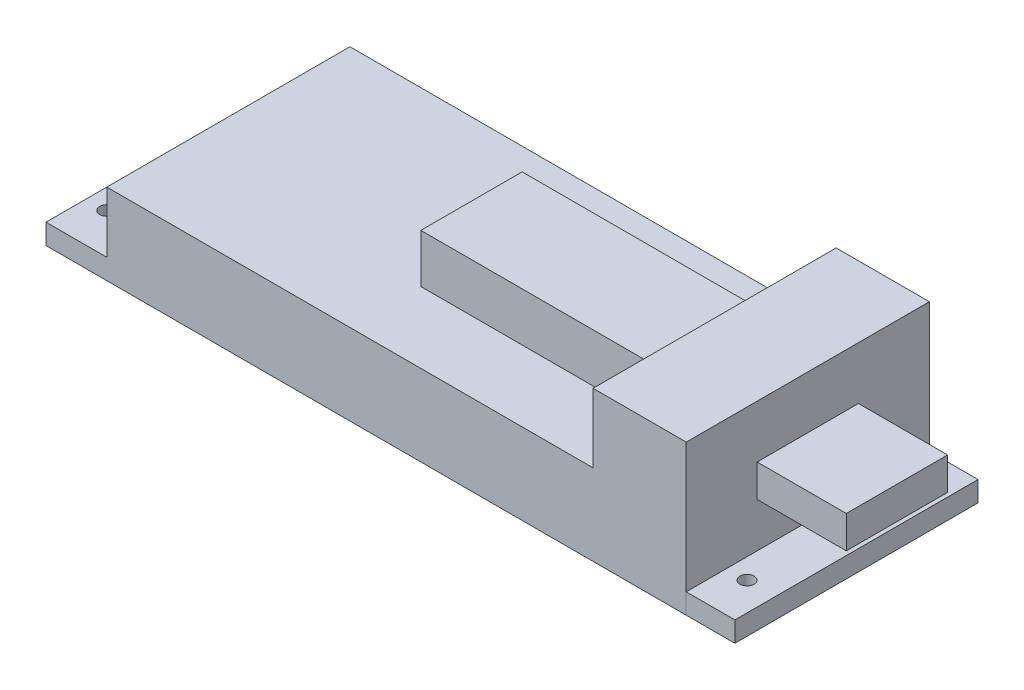
ISO-10303-21;
HEADER;
FILE_DESCRIPTION(('STEP AP214'),'2;1');
FILE_NAME('part.step','',(''),(''),'','','');
FILE_SCHEMA(('AUTOMOTIVE_DESIGN { 1 0 10303 214 1 1 1 1 }'));
ENDSEC;
DATA;
#1=APPLICATION_CONTEXT('core data for automotive mechanical design processes');
#2=APPLICATION_PROTOCOL_DEFINITION('international standard','automotive_design',2000,#1);
#3=PRODUCT_CONTEXT('',#1,'mechanical');
#4=PRODUCT('Part','Part','',(#3));
#5=PRODUCT_RELATED_PRODUCT_CATEGORY('part','',(#4));
#6=PRODUCT_DEFINITION_FORMATION('','',#4);
#7=PRODUCT_DEFINITION_CONTEXT('part definition',#1,'design');
#8=PRODUCT_DEFINITION('design','',#6,#7);
#9=PRODUCT_DEFINITION_SHAPE('','',#8);
#10=(LENGTH_UNIT() NAMED_UNIT(*) SI_UNIT(.MILLI.,.METRE.));
#11=(NAMED_UNIT(*) PLANE_ANGLE_UNIT() SI_UNIT($,.RADIAN.));
#12=(NAMED_UNIT(*) SI_UNIT($,.STERADIAN.) SOLID_ANGLE_UNIT());
#13=UNCERTAINTY_MEASURE_WITH_UNIT(LENGTH_MEASURE(1.E-05),#10,'distance_accuracy_value','');
#14=(GEOMETRIC_REPRESENTATION_CONTEXT(3) GLOBAL_UNCERTAINTY_ASSIGNED_CONTEXT((#13)) GLOBAL_UNIT_ASSIGNED_CONTEXT((#10,
#11,#12)) REPRESENTATION_CONTEXT('',''));
#15=CARTESIAN_POINT('',(0.,0.,0.));
#16=DIRECTION('',(0.,0.,1.));
#17=DIRECTION('',(1.,0.,0.));
#18=AXIS2_PLACEMENT_3D('',#15,#16,#17);
#19=CARTESIAN_POINT('',(73.,5.,0.));
#20=DIRECTION('',(-1.,0.,0.));
#21=DIRECTION('',(0.,0.,1.));
#22=AXIS2_PLACEMENT_3D('',#19,#20,#21);
#23=PLANE('',#22);
#24=DIRECTION('',(0.,0.,-1.));
#25=VECTOR('',#24,1.);
#26=CARTESIAN_POINT('',(73.,0.,0.));
#27=LINE('',#26,#25);
#28=CARTESIAN_POINT('',(73.,0.,30.));
#29=VERTEX_POINT('',#28);
#30=CARTESIAN_POINT('',(73.,0.,-30.));
#31=VERTEX_POINT('',#30);
#32=EDGE_CURVE('E131',#29,#31,#27,.T.);
#33=ORIENTED_EDGE('',*,*,#32,.F.);
#34=DIRECTION('',(0.,-1.,0.));
#35=VECTOR('',#34,1.);
#36=CARTESIAN_POINT('',(73.,5.,30.));
#37=LINE('',#36,#35);
#38=CARTESIAN_POINT('',(73.,5.,30.));
#39=VERTEX_POINT('',#38);
#40=EDGE_CURVE('E12',#39,#29,#37,.T.);
#41=ORIENTED_EDGE('',*,*,#40,.F.);
#42=DIRECTION('',(0.,0.,-1.));
#43=VECTOR('',#42,1.);
#44=CARTESIAN_POINT('',(73.,5.,0.));
#45=LINE('',#44,#43);
#46=CARTESIAN_POINT('',(73.,5.,-30.));
#47=VERTEX_POINT('',#46);
#48=EDGE_CURVE('E111',#39,#47,#45,.T.);
#49=ORIENTED_EDGE('',*,*,#48,.T.);
#50=DIRECTION('',(0.,-1.,0.));
#51=VECTOR('',#50,1.);
#52=CARTESIAN_POINT('',(73.,5.,-30.));
#53=LINE('',#52,#51);
#54=EDGE_CURVE('E72',#47,#31,#53,.T.);
#55=ORIENTED_EDGE('',*,*,#54,.T.);
#56=EDGE_LOOP('',(#33,#41,#49,#55));
#57=FACE_BOUND('',#56,.T.);
#58=ADVANCED_FACE('F55',(#57),#23,.T.);
#59=CARTESIAN_POINT('',(0.,5.,30.));
#60=DIRECTION('',(0.,0.,-1.));
#61=DIRECTION('',(-1.,0.,0.));
#62=AXIS2_PLACEMENT_3D('',#59,#60,#61);
#63=PLANE('',#62);
#64=DIRECTION('',(1.,0.,0.));
#65=VECTOR('',#64,1.);
#66=CARTESIAN_POINT('',(0.,0.,30.));
#67=LINE('',#66,#65);
#68=CARTESIAN_POINT('',(85.,0.,30.));
#69=VERTEX_POINT('',#68);
#70=EDGE_CURVE('E116',#29,#69,#67,.T.);
#71=ORIENTED_EDGE('',*,*,#70,.T.);
#72=DIRECTION('',(0.,-1.,0.));
#73=VECTOR('',#72,1.);
#74=CARTESIAN_POINT('',(85.,5.,30.));
#75=LINE('',#74,#73);
#76=CARTESIAN_POINT('',(85.,5.,30.));
#77=VERTEX_POINT('',#76);
#78=EDGE_CURVE('E64',#77,#69,#75,.T.);
#79=ORIENTED_EDGE('',*,*,#78,.F.);
#80=DIRECTION('',(1.,0.,0.));
#81=VECTOR('',#80,1.);
#82=CARTESIAN_POINT('',(0.,5.,30.));
#83=LINE('',#82,#81);
#84=EDGE_CURVE('E106',#39,#77,#83,.T.);
#85=ORIENTED_EDGE('',*,*,#84,.F.);
#86=ORIENTED_EDGE('',*,*,#40,.T.);
#87=EDGE_LOOP('',(#71,#79,#85,#86));
#88=FACE_BOUND('',#87,.T.);
#89=ADVANCED_FACE('F114',(#88),#63,.F.);
#90=CARTESIAN_POINT('',(85.,5.,0.));
#91=DIRECTION('',(-1.,0.,0.));
#92=DIRECTION('',(0.,0.,1.));
#93=AXIS2_PLACEMENT_3D('',#90,#91,#92);
#94=PLANE('',#93);
#95=DIRECTION('',(0.,0.,-1.));
#96=VECTOR('',#95,1.);
#97=CARTESIAN_POINT('',(85.,0.,0.));
#98=LINE('',#97,#96);
#99=CARTESIAN_POINT('',(85.,0.,-30.));
#100=VERTEX_POINT('',#99);
#101=EDGE_CURVE('E128',#69,#100,#98,.T.);
#102=ORIENTED_EDGE('',*,*,#101,.T.);
#103=DIRECTION('',(0.,-1.,0.));
#104=VECTOR('',#103,1.);
#105=CARTESIAN_POINT('',(85.,5.,-30.));
#106=LINE('',#105,#104);
#107=CARTESIAN_POINT('',(85.,5.,-30.));
#108=VERTEX_POINT('',#107);
#109=EDGE_CURVE('E86',#108,#100,#106,.T.);
#110=ORIENTED_EDGE('',*,*,#109,.F.);
#111=DIRECTION('',(0.,0.,-1.));
#112=VECTOR('',#111,1.);
#113=CARTESIAN_POINT('',(85.,5.,0.));
#114=LINE('',#113,#112);
#115=EDGE_CURVE('E98',#77,#108,#114,.T.);
#116=ORIENTED_EDGE('',*,*,#115,.F.);
#117=ORIENTED_EDGE('',*,*,#78,.T.);
#118=EDGE_LOOP('',(#102,#110,#116,#117));
#119=FACE_BOUND('',#118,.T.);
#120=ADVANCED_FACE('F100',(#119),#94,.F.);
#121=CARTESIAN_POINT('',(0.,5.,-30.));
#122=DIRECTION('',(0.,0.,-1.));
#123=DIRECTION('',(-1.,0.,0.));
#124=AXIS2_PLACEMENT_3D('',#121,#122,#123);
#125=PLANE('',#124);
#126=DIRECTION('',(1.,0.,0.));
#127=VECTOR('',#126,1.);
#128=CARTESIAN_POINT('',(0.,0.,-30.));
#129=LINE('',#128,#127);
#130=EDGE_CURVE('E125',#31,#100,#129,.T.);
#131=ORIENTED_EDGE('',*,*,#130,.F.);
#132=ORIENTED_EDGE('',*,*,#54,.F.);
#133=DIRECTION('',(1.,0.,0.));
#134=VECTOR('',#133,1.);
#135=CARTESIAN_POINT('',(0.,5.,-30.));
#136=LINE('',#135,#134);
#137=EDGE_CURVE('E105',#47,#108,#136,.T.);
#138=ORIENTED_EDGE('',*,*,#137,.T.);
#139=ORIENTED_EDGE('',*,*,#109,.T.);
#140=EDGE_LOOP('',(#131,#132,#138,#139));
#141=FACE_BOUND('',#140,.T.);
#142=ADVANCED_FACE('F165',(#141),#125,.T.);
#143=CARTESIAN_POINT('',(78.,5.,20.));
#144=DIRECTION('',(0.,-1.,0.));
#145=DIRECTION('',(0.,0.,-1.));
#146=AXIS2_PLACEMENT_3D('',#143,#144,#145);
#147=CYLINDRICAL_SURFACE('',#146,1.75);
#148=CARTESIAN_POINT('',(78.,5.,20.));
#149=DIRECTION('',(0.,1.,0.));
#150=DIRECTION('',(0.,0.,1.));
#151=AXIS2_PLACEMENT_3D('',#148,#149,#150);
#152=CIRCLE('',#151,1.75);
#153=CARTESIAN_POINT('',(78.,5.,21.75));
#154=VERTEX_POINT('',#153);
#155=EDGE_CURVE('E124',#154,#154,#152,.T.);
#156=ORIENTED_EDGE('',*,*,#155,.T.);
#157=EDGE_LOOP('',(#156));
#158=FACE_BOUND('',#157,.T.);
#159=CARTESIAN_POINT('',(78.,0.,20.));
#160=DIRECTION('',(0.,1.,0.));
#161=DIRECTION('',(0.,0.,1.));
#162=AXIS2_PLACEMENT_3D('',#159,#160,#161);
#163=CIRCLE('',#162,1.75);
#164=CARTESIAN_POINT('',(78.,0.,21.75));
#165=VERTEX_POINT('',#164);
#166=EDGE_CURVE('E133',#165,#165,#163,.T.);
#167=ORIENTED_EDGE('',*,*,#166,.F.);
#168=EDGE_LOOP('',(#167));
#169=FACE_BOUND('',#168,.T.);
#170=ADVANCED_FACE('F57',(#158,#169),#147,.F.);
#171=CARTESIAN_POINT('',(78.,5.,-20.));
#172=DIRECTION('',(0.,-1.,0.));
#173=DIRECTION('',(0.,0.,-1.));
#174=AXIS2_PLACEMENT_3D('',#171,#172,#173);
#175=CYLINDRICAL_SURFACE('',#174,1.75);
#176=CARTESIAN_POINT('',(78.,5.,-20.));
#177=DIRECTION('',(0.,1.,0.));
#178=DIRECTION('',(0.,0.,1.));
#179=AXIS2_PLACEMENT_3D('',#176,#177,#178);
#180=CIRCLE('',#179,1.75);
#181=CARTESIAN_POINT('',(78.,5.,-18.25));
#182=VERTEX_POINT('',#181);
#183=EDGE_CURVE('E120',#182,#182,#180,.T.);
#184=ORIENTED_EDGE('',*,*,#183,.T.);
#185=EDGE_LOOP('',(#184));
#186=FACE_BOUND('',#185,.T.);
#187=CARTESIAN_POINT('',(78.,0.,-20.));
#188=DIRECTION('',(0.,1.,0.));
#189=DIRECTION('',(0.,0.,1.));
#190=AXIS2_PLACEMENT_3D('',#187,#188,#189);
#191=CIRCLE('',#190,1.75);
#192=CARTESIAN_POINT('',(78.,0.,-18.25));
#193=VERTEX_POINT('',#192);
#194=EDGE_CURVE('E121',#193,#193,#191,.T.);
#195=ORIENTED_EDGE('',*,*,#194,.F.);
#196=EDGE_LOOP('',(#195));
#197=FACE_BOUND('',#196,.T.);
#198=ADVANCED_FACE('F147',(#186,#197),#175,.F.);
#199=CARTESIAN_POINT('',(0.,5.,0.));
#200=DIRECTION('',(0.,1.,0.));
#201=DIRECTION('',(0.,0.,1.));
#202=AXIS2_PLACEMENT_3D('',#199,#200,#201);
#203=PLANE('',#202);
#204=ORIENTED_EDGE('',*,*,#155,.F.);
#205=EDGE_LOOP('',(#204));
#206=FACE_BOUND('',#205,.T.);
#207=ORIENTED_EDGE('',*,*,#48,.F.);
#208=ORIENTED_EDGE('',*,*,#84,.T.);
#209=ORIENTED_EDGE('',*,*,#115,.T.);
#210=ORIENTED_EDGE('',*,*,#137,.F.);
#211=EDGE_LOOP('',(#207,#208,#209,#210));
#212=FACE_BOUND('',#211,.T.);
#213=ORIENTED_EDGE('',*,*,#183,.F.);
#214=EDGE_LOOP('',(#213));
#215=FACE_BOUND('',#214,.T.);
#216=ADVANCED_FACE('F109',(#206,#212,#215),#203,.T.);
#217=CARTESIAN_POINT('',(0.,0.,0.));
#218=DIRECTION('',(0.,1.,0.));
#219=DIRECTION('',(0.,0.,1.));
#220=AXIS2_PLACEMENT_3D('',#217,#218,#219);
#221=PLANE('',#220);
#222=ORIENTED_EDGE('',*,*,#166,.T.);
#223=EDGE_LOOP('',(#222));
#224=FACE_BOUND('',#223,.T.);
#225=ORIENTED_EDGE('',*,*,#32,.T.);
#226=ORIENTED_EDGE('',*,*,#130,.T.);
#227=ORIENTED_EDGE('',*,*,#101,.F.);
#228=ORIENTED_EDGE('',*,*,#70,.F.);
#229=EDGE_LOOP('',(#225,#226,#227,#228));
#230=FACE_BOUND('',#229,.T.);
#231=ORIENTED_EDGE('',*,*,#194,.T.);
#232=EDGE_LOOP('',(#231));
#233=FACE_BOUND('',#232,.T.);
#234=ADVANCED_FACE('F146',(#224,#230,#233),#221,.F.);
#235=CLOSED_SHELL('',(#58,#89,#120,#142,#170,#198,#216,#234));
#236=MANIFOLD_SOLID_BREP('B2',#235);
#237=CARTESIAN_POINT('',(73.,37.,0.));
#238=DIRECTION('',(-1.,0.,0.));
#239=DIRECTION('',(0.,0.,1.));
#240=AXIS2_PLACEMENT_3D('',#237,#238,#239);
#241=PLANE('',#240);
#242=DIRECTION('',(0.,0.,-1.));
#243=VECTOR('',#242,1.);
#244=CARTESIAN_POINT('',(73.,0.,0.));
#245=LINE('',#244,#243);
#246=CARTESIAN_POINT('',(73.,0.,30.));
#247=VERTEX_POINT('',#246);
#248=CARTESIAN_POINT('',(73.,0.,-30.));
#249=VERTEX_POINT('',#248);
#250=EDGE_CURVE('E381',#247,#249,#245,.T.);
#251=ORIENTED_EDGE('',*,*,#250,.T.);
#252=DIRECTION('',(0.,-1.,0.));
#253=VECTOR('',#252,1.);
#254=CARTESIAN_POINT('',(73.,37.,-30.));
#255=LINE('',#254,#253);
#256=CARTESIAN_POINT('',(73.,37.,-30.));
#257=VERTEX_POINT('',#256);
#258=EDGE_CURVE('E448',#257,#249,#255,.T.);
#259=ORIENTED_EDGE('',*,*,#258,.F.);
#260=DIRECTION('',(0.,0.,-1.));
#261=VECTOR('',#260,1.);
#262=CARTESIAN_POINT('',(73.,37.,0.));
#263=LINE('',#262,#261);
#264=CARTESIAN_POINT('',(73.,37.,30.));
#265=VERTEX_POINT('',#264);
#266=EDGE_CURVE('E427',#265,#257,#263,.T.);
#267=ORIENTED_EDGE('',*,*,#266,.F.);
#268=DIRECTION('',(0.,-1.,0.));
#269=VECTOR('',#268,1.);
#270=CARTESIAN_POINT('',(73.,37.,30.));
#271=LINE('',#270,#269);
#272=EDGE_CURVE('E452',#265,#247,#271,.T.);
#273=ORIENTED_EDGE('',*,*,#272,.T.);
#274=EDGE_LOOP('',(#251,#259,#267,#273));
#275=FACE_BOUND('',#274,.T.);
#276=DIRECTION('',(0.,0.,-1.));
#277=VECTOR('',#276,1.);
#278=CARTESIAN_POINT('',(73.,16.,0.));
#279=LINE('',#278,#277);
#280=CARTESIAN_POINT('',(73.,16.,12.5));
#281=VERTEX_POINT('',#280);
#282=CARTESIAN_POINT('',(73.,16.,-12.5));
#283=VERTEX_POINT('',#282);
#284=EDGE_CURVE('E265',#281,#283,#279,.T.);
#285=ORIENTED_EDGE('',*,*,#284,.F.);
#286=DIRECTION('',(0.,-1.,0.));
#287=VECTOR('',#286,1.);
#288=CARTESIAN_POINT('',(73.,24.,12.5));
#289=LINE('',#288,#287);
#290=CARTESIAN_POINT('',(73.,24.,12.5));
#291=VERTEX_POINT('',#290);
#292=EDGE_CURVE('E404',#291,#281,#289,.T.);
#293=ORIENTED_EDGE('',*,*,#292,.F.);
#294=DIRECTION('',(0.,0.,-1.));
#295=VECTOR('',#294,1.);
#296=CARTESIAN_POINT('',(73.,24.,0.));
#297=LINE('',#296,#295);
#298=CARTESIAN_POINT('',(73.,24.,-12.5));
#299=VERTEX_POINT('',#298);
#300=EDGE_CURVE('E391',#291,#299,#297,.T.);
#301=ORIENTED_EDGE('',*,*,#300,.T.);
#302=DIRECTION('',(0.,-1.,0.));
#303=VECTOR('',#302,1.);
#304=CARTESIAN_POINT('',(73.,24.,-12.5));
#305=LINE('',#304,#303);
#306=EDGE_CURVE('E417',#299,#283,#305,.T.);
#307=ORIENTED_EDGE('',*,*,#306,.T.);
#308=EDGE_LOOP('',(#285,#293,#301,#307));
#309=FACE_BOUND('',#308,.T.);
#310=ADVANCED_FACE('F249',(#275,#309),#241,.F.);
#311=CARTESIAN_POINT('',(0.,5.,-30.));
#312=DIRECTION('',(0.,0.,-1.));
#313=DIRECTION('',(-1.,0.,0.));
#314=AXIS2_PLACEMENT_3D('',#311,#312,#313);
#315=PLANE('',#314);
#316=DIRECTION('',(1.,0.,0.));
#317=VECTOR('',#316,1.);
#318=CARTESIAN_POINT('',(0.,0.,-30.));
#319=LINE('',#318,#317);
#320=CARTESIAN_POINT('',(-85.,0.,-30.));
#321=VERTEX_POINT('',#320);
#322=EDGE_CURVE('E521',#321,#249,#319,.T.);
#323=ORIENTED_EDGE('',*,*,#322,.F.);
#324=DIRECTION('',(0.,-1.,0.));
#325=VECTOR('',#324,1.);
#326=CARTESIAN_POINT('',(-85.,5.,-30.));
#327=LINE('',#326,#325);
#328=CARTESIAN_POINT('',(-85.,5.,-30.));
#329=VERTEX_POINT('',#328);
#330=EDGE_CURVE('E53',#329,#321,#327,.T.);
#331=ORIENTED_EDGE('',*,*,#330,.F.);
#332=DIRECTION('',(1.,0.,0.));
#333=VECTOR('',#332,1.);
#334=CARTESIAN_POINT('',(0.,5.,-30.));
#335=LINE('',#334,#333);
#336=CARTESIAN_POINT('',(-70.,5.,-30.));
#337=VERTEX_POINT('',#336);
#338=EDGE_CURVE('E524',#329,#337,#335,.T.);
#339=ORIENTED_EDGE('',*,*,#338,.T.);
#340=DIRECTION('',(0.,-1.,0.));
#341=VECTOR('',#340,1.);
#342=CARTESIAN_POINT('',(-70.,20.,-30.));
#343=LINE('',#342,#341);
#344=CARTESIAN_POINT('',(-70.,20.,-30.));
#345=VERTEX_POINT('',#344);
#346=EDGE_CURVE('E517',#345,#337,#343,.T.);
#347=ORIENTED_EDGE('',*,*,#346,.F.);
#348=DIRECTION('',(1.,0.,0.));
#349=VECTOR('',#348,1.);
#350=CARTESIAN_POINT('',(0.,20.,-30.));
#351=LINE('',#350,#349);
#352=CARTESIAN_POINT('',(50.,20.,-30.));
#353=VERTEX_POINT('',#352);
#354=EDGE_CURVE('E502',#345,#353,#351,.T.);
#355=ORIENTED_EDGE('',*,*,#354,.T.);
#356=DIRECTION('',(0.,-1.,0.));
#357=VECTOR('',#356,1.);
#358=CARTESIAN_POINT('',(50.,37.,-30.));
#359=LINE('',#358,#357);
#360=CARTESIAN_POINT('',(50.,37.,-30.));
#361=VERTEX_POINT('',#360);
#362=EDGE_CURVE('E444',#361,#353,#359,.T.);
#363=ORIENTED_EDGE('',*,*,#362,.F.);
#364=DIRECTION('',(1.,0.,0.));
#365=VECTOR('',#364,1.);
#366=CARTESIAN_POINT('',(0.,37.,-30.));
#367=LINE('',#366,#365);
#368=EDGE_CURVE('E430',#361,#257,#367,.T.);
#369=ORIENTED_EDGE('',*,*,#368,.T.);
#370=ORIENTED_EDGE('',*,*,#258,.T.);
#371=EDGE_LOOP('',(#323,#331,#339,#347,#355,#363,#369,#370));
#372=FACE_BOUND('',#371,.T.);
#373=ADVANCED_FACE('F251',(#372),#315,.T.);
#374=CARTESIAN_POINT('',(-85.,5.,0.));
#375=DIRECTION('',(-1.,0.,0.));
#376=DIRECTION('',(0.,0.,1.));
#377=AXIS2_PLACEMENT_3D('',#374,#375,#376);
#378=PLANE('',#377);
#379=DIRECTION('',(0.,0.,-1.));
#380=VECTOR('',#379,1.);
#381=CARTESIAN_POINT('',(-85.,0.,0.));
#382=LINE('',#381,#380);
#383=CARTESIAN_POINT('',(-85.,0.,30.));
#384=VERTEX_POINT('',#383);
#385=EDGE_CURVE('E544',#384,#321,#382,.T.);
#386=ORIENTED_EDGE('',*,*,#385,.F.);
#387=DIRECTION('',(0.,-1.,0.));
#388=VECTOR('',#387,1.);
#389=CARTESIAN_POINT('',(-85.,5.,30.));
#390=LINE('',#389,#388);
#391=CARTESIAN_POINT('',(-85.,5.,30.));
#392=VERTEX_POINT('',#391);
#393=EDGE_CURVE('E258',#392,#384,#390,.T.);
#394=ORIENTED_EDGE('',*,*,#393,.F.);
#395=DIRECTION('',(0.,0.,-1.));
#396=VECTOR('',#395,1.);
#397=CARTESIAN_POINT('',(-85.,5.,0.));
#398=LINE('',#397,#396);
#399=EDGE_CURVE('E528',#392,#329,#398,.T.);
#400=ORIENTED_EDGE('',*,*,#399,.T.);
#401=ORIENTED_EDGE('',*,*,#330,.T.);
#402=EDGE_LOOP('',(#386,#394,#400,#401));
#403=FACE_BOUND('',#402,.T.);
#404=ADVANCED_FACE('F608',(#403),#378,.T.);
#405=CARTESIAN_POINT('',(-80.,5.,-20.));
#406=DIRECTION('',(0.,-1.,0.));
#407=DIRECTION('',(0.,0.,-1.));
#408=AXIS2_PLACEMENT_3D('',#405,#406,#407);
#409=CYLINDRICAL_SURFACE('',#408,1.75);
#410=CARTESIAN_POINT('',(-80.,5.,-20.));
#411=DIRECTION('',(0.,1.,0.));
#412=DIRECTION('',(0.,0.,1.));
#413=AXIS2_PLACEMENT_3D('',#410,#411,#412);
#414=CIRCLE('',#413,1.75);
#415=CARTESIAN_POINT('',(-80.,5.,-18.25));
#416=VERTEX_POINT('',#415);
#417=EDGE_CURVE('E534',#416,#416,#414,.T.);
#418=ORIENTED_EDGE('',*,*,#417,.T.);
#419=EDGE_LOOP('',(#418));
#420=FACE_BOUND('',#419,.T.);
#421=CARTESIAN_POINT('',(-80.,0.,-20.));
#422=DIRECTION('',(0.,1.,0.));
#423=DIRECTION('',(0.,0.,1.));
#424=AXIS2_PLACEMENT_3D('',#421,#422,#423);
#425=CIRCLE('',#424,1.75);
#426=CARTESIAN_POINT('',(-80.,0.,-18.25));
#427=VERTEX_POINT('',#426);
#428=EDGE_CURVE('E551',#427,#427,#425,.T.);
#429=ORIENTED_EDGE('',*,*,#428,.F.);
#430=EDGE_LOOP('',(#429));
#431=FACE_BOUND('',#430,.T.);
#432=ADVANCED_FACE('F734',(#420,#431),#409,.F.);
#433=CARTESIAN_POINT('',(0.,5.,30.));
#434=DIRECTION('',(0.,0.,-1.));
#435=DIRECTION('',(-1.,0.,0.));
#436=AXIS2_PLACEMENT_3D('',#433,#434,#435);
#437=PLANE('',#436);
#438=DIRECTION('',(1.,0.,0.));
#439=VECTOR('',#438,1.);
#440=CARTESIAN_POINT('',(0.,0.,30.));
#441=LINE('',#440,#439);
#442=EDGE_CURVE('E548',#384,#247,#441,.T.);
#443=ORIENTED_EDGE('',*,*,#442,.T.);
#444=ORIENTED_EDGE('',*,*,#272,.F.);
#445=DIRECTION('',(1.,0.,0.));
#446=VECTOR('',#445,1.);
#447=CARTESIAN_POINT('',(0.,37.,30.));
#448=LINE('',#447,#446);
#449=CARTESIAN_POINT('',(50.,37.,30.));
#450=VERTEX_POINT('',#449);
#451=EDGE_CURVE('E423',#450,#265,#448,.T.);
#452=ORIENTED_EDGE('',*,*,#451,.F.);
#453=DIRECTION('',(0.,-1.,0.));
#454=VECTOR('',#453,1.);
#455=CARTESIAN_POINT('',(50.,37.,30.));
#456=LINE('',#455,#454);
#457=CARTESIAN_POINT('',(50.,20.,30.));
#458=VERTEX_POINT('',#457);
#459=EDGE_CURVE('E437',#450,#458,#456,.T.);
#460=ORIENTED_EDGE('',*,*,#459,.T.);
#461=DIRECTION('',(1.,0.,0.));
#462=VECTOR('',#461,1.);
#463=CARTESIAN_POINT('',(0.,20.,30.));
#464=LINE('',#463,#462);
#465=CARTESIAN_POINT('',(-70.,20.,30.));
#466=VERTEX_POINT('',#465);
#467=EDGE_CURVE('E510',#466,#458,#464,.T.);
#468=ORIENTED_EDGE('',*,*,#467,.F.);
#469=DIRECTION('',(0.,-1.,0.));
#470=VECTOR('',#469,1.);
#471=CARTESIAN_POINT('',(-70.,20.,30.));
#472=LINE('',#471,#470);
#473=CARTESIAN_POINT('',(-70.,5.,30.));
#474=VERTEX_POINT('',#473);
#475=EDGE_CURVE('E513',#466,#474,#472,.T.);
#476=ORIENTED_EDGE('',*,*,#475,.T.);
#477=DIRECTION('',(1.,0.,0.));
#478=VECTOR('',#477,1.);
#479=CARTESIAN_POINT('',(0.,5.,30.));
#480=LINE('',#479,#478);
#481=EDGE_CURVE('E531',#392,#474,#480,.T.);
#482=ORIENTED_EDGE('',*,*,#481,.F.);
#483=ORIENTED_EDGE('',*,*,#393,.T.);
#484=EDGE_LOOP('',(#443,#444,#452,#460,#468,#476,#482,#483));
#485=FACE_BOUND('',#484,.T.);
#486=ADVANCED_FACE('F568',(#485),#437,.F.);
#487=CARTESIAN_POINT('',(-80.,5.,20.));
#488=DIRECTION('',(0.,-1.,0.));
#489=DIRECTION('',(0.,0.,-1.));
#490=AXIS2_PLACEMENT_3D('',#487,#488,#489);
#491=CYLINDRICAL_SURFACE('',#490,1.75);
#492=CARTESIAN_POINT('',(-80.,5.,20.));
#493=DIRECTION('',(0.,1.,0.));
#494=DIRECTION('',(0.,0.,1.));
#495=AXIS2_PLACEMENT_3D('',#492,#493,#494);
#496=CIRCLE('',#495,1.75);
#497=CARTESIAN_POINT('',(-80.,5.,21.75));
#498=VERTEX_POINT('',#497);
#499=EDGE_CURVE('E538',#498,#498,#496,.F.);
#500=ORIENTED_EDGE('',*,*,#499,.F.);
#501=EDGE_LOOP('',(#500));
#502=FACE_BOUND('',#501,.T.);
#503=CARTESIAN_POINT('',(-80.,0.,20.));
#504=DIRECTION('',(0.,1.,0.));
#505=DIRECTION('',(0.,0.,1.));
#506=AXIS2_PLACEMENT_3D('',#503,#504,#505);
#507=CIRCLE('',#506,1.75);
#508=CARTESIAN_POINT('',(-80.,0.,21.75));
#509=VERTEX_POINT('',#508);
#510=EDGE_CURVE('E525',#509,#509,#507,.F.);
#511=ORIENTED_EDGE('',*,*,#510,.T.);
#512=EDGE_LOOP('',(#511));
#513=FACE_BOUND('',#512,.T.);
#514=ADVANCED_FACE('F733',(#502,#513),#491,.F.);
#515=CARTESIAN_POINT('',(0.,5.,0.));
#516=DIRECTION('',(0.,1.,0.));
#517=DIRECTION('',(0.,0.,1.));
#518=AXIS2_PLACEMENT_3D('',#515,#516,#517);
#519=PLANE('',#518);
#520=DIRECTION('',(0.,0.,1.));
#521=VECTOR('',#520,1.);
#522=CARTESIAN_POINT('',(-70.,5.,0.));
#523=LINE('',#522,#521);
#524=EDGE_CURVE('E291',#337,#474,#523,.T.);
#525=ORIENTED_EDGE('',*,*,#524,.F.);
#526=ORIENTED_EDGE('',*,*,#338,.F.);
#527=ORIENTED_EDGE('',*,*,#399,.F.);
#528=ORIENTED_EDGE('',*,*,#481,.T.);
#529=EDGE_LOOP('',(#525,#526,#527,#528));
#530=FACE_BOUND('',#529,.T.);
#531=ORIENTED_EDGE('',*,*,#417,.F.);
#532=EDGE_LOOP('',(#531));
#533=FACE_BOUND('',#532,.T.);
#534=ORIENTED_EDGE('',*,*,#499,.T.);
#535=EDGE_LOOP('',(#534));
#536=FACE_BOUND('',#535,.T.);
#537=ADVANCED_FACE('F717',(#530,#533,#536),#519,.T.);
#538=CARTESIAN_POINT('',(0.,0.,0.));
#539=DIRECTION('',(0.,1.,0.));
#540=DIRECTION('',(0.,0.,1.));
#541=AXIS2_PLACEMENT_3D('',#538,#539,#540);
#542=PLANE('',#541);
#543=ORIENTED_EDGE('',*,*,#322,.T.);
#544=ORIENTED_EDGE('',*,*,#250,.F.);
#545=ORIENTED_EDGE('',*,*,#442,.F.);
#546=ORIENTED_EDGE('',*,*,#385,.T.);
#547=EDGE_LOOP('',(#543,#544,#545,#546));
#548=FACE_BOUND('',#547,.T.);
#549=ORIENTED_EDGE('',*,*,#428,.T.);
#550=EDGE_LOOP('',(#549));
#551=FACE_BOUND('',#550,.T.);
#552=ORIENTED_EDGE('',*,*,#510,.F.);
#553=EDGE_LOOP('',(#552));
#554=FACE_BOUND('',#553,.T.);
#555=ADVANCED_FACE('F710',(#548,#551,#554),#542,.F.);
#556=CARTESIAN_POINT('',(-70.,20.,0.));
#557=DIRECTION('',(1.,0.,0.));
#558=DIRECTION('',(0.,0.,-1.));
#559=AXIS2_PLACEMENT_3D('',#556,#557,#558);
#560=PLANE('',#559);
#561=ORIENTED_EDGE('',*,*,#346,.T.);
#562=ORIENTED_EDGE('',*,*,#524,.T.);
#563=ORIENTED_EDGE('',*,*,#475,.F.);
#564=DIRECTION('',(0.,0.,1.));
#565=VECTOR('',#564,1.);
#566=CARTESIAN_POINT('',(-70.,20.,0.));
#567=LINE('',#566,#565);
#568=EDGE_CURVE('E507',#345,#466,#567,.T.);
#569=ORIENTED_EDGE('',*,*,#568,.F.);
#570=EDGE_LOOP('',(#561,#562,#563,#569));
#571=FACE_BOUND('',#570,.T.);
#572=ADVANCED_FACE('F600',(#571),#560,.F.);
#573=CARTESIAN_POINT('',(0.,20.,0.));
#574=DIRECTION('',(0.,1.,0.));
#575=DIRECTION('',(0.,0.,1.));
#576=AXIS2_PLACEMENT_3D('',#573,#574,#575);
#577=PLANE('',#576);
#578=DIRECTION('',(1.,0.,0.));
#579=VECTOR('',#578,1.);
#580=CARTESIAN_POINT('',(0.,20.,12.5));
#581=LINE('',#580,#579);
#582=CARTESIAN_POINT('',(-9.99999999999999,20.,12.5));
#583=VERTEX_POINT('',#582);
#584=CARTESIAN_POINT('',(50.,20.,12.5));
#585=VERTEX_POINT('',#584);
#586=EDGE_CURVE('E486',#583,#585,#581,.T.);
#587=ORIENTED_EDGE('',*,*,#586,.F.);
#588=DIRECTION('',(0.,0.,1.));
#589=VECTOR('',#588,1.);
#590=CARTESIAN_POINT('',(-9.99999999999999,20.,0.));
#591=LINE('',#590,#589);
#592=CARTESIAN_POINT('',(-9.99999999999999,20.,-12.5));
#593=VERTEX_POINT('',#592);
#594=EDGE_CURVE('E490',#593,#583,#591,.T.);
#595=ORIENTED_EDGE('',*,*,#594,.F.);
#596=DIRECTION('',(-1.,0.,0.));
#597=VECTOR('',#596,1.);
#598=CARTESIAN_POINT('',(0.,20.,-12.5));
#599=LINE('',#598,#597);
#600=CARTESIAN_POINT('',(50.,20.,-12.5));
#601=VERTEX_POINT('',#600);
#602=EDGE_CURVE('E494',#601,#593,#599,.T.);
#603=ORIENTED_EDGE('',*,*,#602,.F.);
#604=DIRECTION('',(0.,0.,1.));
#605=VECTOR('',#604,1.);
#606=CARTESIAN_POINT('',(50.,20.,0.));
#607=LINE('',#606,#605);
#608=EDGE_CURVE('E498',#353,#601,#607,.T.);
#609=ORIENTED_EDGE('',*,*,#608,.F.);
#610=ORIENTED_EDGE('',*,*,#354,.F.);
#611=ORIENTED_EDGE('',*,*,#568,.T.);
#612=ORIENTED_EDGE('',*,*,#467,.T.);
#613=EDGE_CURVE('E503',#585,#458,#607,.T.);
#614=ORIENTED_EDGE('',*,*,#613,.F.);
#615=EDGE_LOOP('',(#587,#595,#603,#609,#610,#611,#612,#614));
#616=FACE_BOUND('',#615,.T.);
#617=ADVANCED_FACE('F579',(#616),#577,.T.);
#618=CARTESIAN_POINT('',(-9.99999999999999,32.,0.));
#619=DIRECTION('',(1.,0.,0.));
#620=DIRECTION('',(0.,0.,-1.));
#621=AXIS2_PLACEMENT_3D('',#618,#619,#620);
#622=PLANE('',#621);
#623=ORIENTED_EDGE('',*,*,#594,.T.);
#624=DIRECTION('',(0.,-1.,0.));
#625=VECTOR('',#624,1.);
#626=CARTESIAN_POINT('',(-9.99999999999999,32.,12.5));
#627=LINE('',#626,#625);
#628=CARTESIAN_POINT('',(-9.99999999999999,32.,12.5));
#629=VERTEX_POINT('',#628);
#630=EDGE_CURVE('E482',#629,#583,#627,.T.);
#631=ORIENTED_EDGE('',*,*,#630,.F.);
#632=DIRECTION('',(0.,0.,1.));
#633=VECTOR('',#632,1.);
#634=CARTESIAN_POINT('',(-9.99999999999999,32.,0.));
#635=LINE('',#634,#633);
#636=CARTESIAN_POINT('',(-9.99999999999999,32.,-12.5));
#637=VERTEX_POINT('',#636);
#638=EDGE_CURVE('E456',#637,#629,#635,.T.);
#639=ORIENTED_EDGE('',*,*,#638,.F.);
#640=DIRECTION('',(0.,-1.,0.));
#641=VECTOR('',#640,1.);
#642=CARTESIAN_POINT('',(-9.99999999999999,32.,-12.5));
#643=LINE('',#642,#641);
#644=EDGE_CURVE('E470',#637,#593,#643,.T.);
#645=ORIENTED_EDGE('',*,*,#644,.T.);
#646=EDGE_LOOP('',(#623,#631,#639,#645));
#647=FACE_BOUND('',#646,.T.);
#648=ADVANCED_FACE('F592',(#647),#622,.F.);
#649=CARTESIAN_POINT('',(0.,32.,12.5));
#650=DIRECTION('',(0.,0.,-1.));
#651=DIRECTION('',(-1.,0.,0.));
#652=AXIS2_PLACEMENT_3D('',#649,#650,#651);
#653=PLANE('',#652);
#654=ORIENTED_EDGE('',*,*,#586,.T.);
#655=DIRECTION('',(0.,-1.,0.));
#656=VECTOR('',#655,1.);
#657=CARTESIAN_POINT('',(50.,32.,12.5));
#658=LINE('',#657,#656);
#659=CARTESIAN_POINT('',(50.,32.,12.5));
#660=VERTEX_POINT('',#659);
#661=EDGE_CURVE('E478',#660,#585,#658,.T.);
#662=ORIENTED_EDGE('',*,*,#661,.F.);
#663=DIRECTION('',(1.,0.,0.));
#664=VECTOR('',#663,1.);
#665=CARTESIAN_POINT('',(0.,32.,12.5));
#666=LINE('',#665,#664);
#667=EDGE_CURVE('E460',#629,#660,#666,.T.);
#668=ORIENTED_EDGE('',*,*,#667,.F.);
#669=ORIENTED_EDGE('',*,*,#630,.T.);
#670=EDGE_LOOP('',(#654,#662,#668,#669));
#671=FACE_BOUND('',#670,.T.);
#672=ADVANCED_FACE('F590',(#671),#653,.F.);
#673=CARTESIAN_POINT('',(0.,32.,-12.5));
#674=DIRECTION('',(0.,0.,1.));
#675=DIRECTION('',(1.,0.,0.));
#676=AXIS2_PLACEMENT_3D('',#673,#674,#675);
#677=PLANE('',#676);
#678=ORIENTED_EDGE('',*,*,#602,.T.);
#679=ORIENTED_EDGE('',*,*,#644,.F.);
#680=DIRECTION('',(-1.,0.,0.));
#681=VECTOR('',#680,1.);
#682=CARTESIAN_POINT('',(0.,32.,-12.5));
#683=LINE('',#682,#681);
#684=CARTESIAN_POINT('',(50.,32.,-12.5));
#685=VERTEX_POINT('',#684);
#686=EDGE_CURVE('E467',#685,#637,#683,.T.);
#687=ORIENTED_EDGE('',*,*,#686,.F.);
#688=DIRECTION('',(0.,-1.,0.));
#689=VECTOR('',#688,1.);
#690=CARTESIAN_POINT('',(50.,32.,-12.5));
#691=LINE('',#690,#689);
#692=EDGE_CURVE('E474',#685,#601,#691,.T.);
#693=ORIENTED_EDGE('',*,*,#692,.T.);
#694=EDGE_LOOP('',(#678,#679,#687,#693));
#695=FACE_BOUND('',#694,.T.);
#696=ADVANCED_FACE('F583',(#695),#677,.F.);
#697=CARTESIAN_POINT('',(0.,32.,0.));
#698=DIRECTION('',(0.,1.,0.));
#699=DIRECTION('',(0.,0.,1.));
#700=AXIS2_PLACEMENT_3D('',#697,#698,#699);
#701=PLANE('',#700);
#702=ORIENTED_EDGE('',*,*,#638,.T.);
#703=ORIENTED_EDGE('',*,*,#667,.T.);
#704=DIRECTION('',(0.,0.,1.));
#705=VECTOR('',#704,1.);
#706=CARTESIAN_POINT('',(50.,32.,0.));
#707=LINE('',#706,#705);
#708=EDGE_CURVE('E463',#685,#660,#707,.T.);
#709=ORIENTED_EDGE('',*,*,#708,.F.);
#710=ORIENTED_EDGE('',*,*,#686,.T.);
#711=EDGE_LOOP('',(#702,#703,#709,#710));
#712=FACE_BOUND('',#711,.T.);
#713=ADVANCED_FACE('F586',(#712),#701,.T.);
#714=CARTESIAN_POINT('',(50.,37.,0.));
#715=DIRECTION('',(1.,0.,0.));
#716=DIRECTION('',(0.,0.,-1.));
#717=AXIS2_PLACEMENT_3D('',#714,#715,#716);
#718=PLANE('',#717);
#719=ORIENTED_EDGE('',*,*,#362,.T.);
#720=ORIENTED_EDGE('',*,*,#608,.T.);
#721=ORIENTED_EDGE('',*,*,#692,.F.);
#722=ORIENTED_EDGE('',*,*,#708,.T.);
#723=ORIENTED_EDGE('',*,*,#661,.T.);
#724=ORIENTED_EDGE('',*,*,#613,.T.);
#725=ORIENTED_EDGE('',*,*,#459,.F.);
#726=DIRECTION('',(0.,0.,1.));
#727=VECTOR('',#726,1.);
#728=CARTESIAN_POINT('',(50.,37.,0.));
#729=LINE('',#728,#727);
#730=EDGE_CURVE('E434',#361,#450,#729,.T.);
#731=ORIENTED_EDGE('',*,*,#730,.F.);
#732=EDGE_LOOP('',(#719,#720,#721,#722,#723,#724,#725,#731));
#733=FACE_BOUND('',#732,.T.);
#734=ADVANCED_FACE('F562',(#733),#718,.F.);
#735=CARTESIAN_POINT('',(0.,37.,0.));
#736=DIRECTION('',(0.,1.,0.));
#737=DIRECTION('',(0.,0.,1.));
#738=AXIS2_PLACEMENT_3D('',#735,#736,#737);
#739=PLANE('',#738);
#740=ORIENTED_EDGE('',*,*,#451,.T.);
#741=ORIENTED_EDGE('',*,*,#266,.T.);
#742=ORIENTED_EDGE('',*,*,#368,.F.);
#743=ORIENTED_EDGE('',*,*,#730,.T.);
#744=EDGE_LOOP('',(#740,#741,#742,#743));
#745=FACE_BOUND('',#744,.T.);
#746=ADVANCED_FACE('F571',(#745),#739,.T.);
#747=CARTESIAN_POINT('',(0.,24.,12.5));
#748=DIRECTION('',(0.,0.,1.));
#749=DIRECTION('',(1.,0.,0.));
#750=AXIS2_PLACEMENT_3D('',#747,#748,#749);
#751=PLANE('',#750);
#752=DIRECTION('',(-1.,0.,0.));
#753=VECTOR('',#752,1.);
#754=CARTESIAN_POINT('',(0.,16.,12.5));
#755=LINE('',#754,#753);
#756=CARTESIAN_POINT('',(95.,16.,12.5));
#757=VERTEX_POINT('',#756);
#758=EDGE_CURVE('E375',#757,#281,#755,.T.);
#759=ORIENTED_EDGE('',*,*,#758,.F.);
#760=DIRECTION('',(0.,-1.,0.));
#761=VECTOR('',#760,1.);
#762=CARTESIAN_POINT('',(95.,24.,12.5));
#763=LINE('',#762,#761);
#764=CARTESIAN_POINT('',(95.,24.,12.5));
#765=VERTEX_POINT('',#764);
#766=EDGE_CURVE('E370',#765,#757,#763,.T.);
#767=ORIENTED_EDGE('',*,*,#766,.F.);
#768=DIRECTION('',(-1.,0.,0.));
#769=VECTOR('',#768,1.);
#770=CARTESIAN_POINT('',(0.,24.,12.5));
#771=LINE('',#770,#769);
#772=EDGE_CURVE('E373',#765,#291,#771,.T.);
#773=ORIENTED_EDGE('',*,*,#772,.T.);
#774=ORIENTED_EDGE('',*,*,#292,.T.);
#775=EDGE_LOOP('',(#759,#767,#773,#774));
#776=FACE_BOUND('',#775,.T.);
#777=ADVANCED_FACE('F372',(#776),#751,.T.);
#778=CARTESIAN_POINT('',(95.,24.,0.));
#779=DIRECTION('',(1.,0.,0.));
#780=DIRECTION('',(0.,0.,-1.));
#781=AXIS2_PLACEMENT_3D('',#778,#779,#780);
#782=PLANE('',#781);
#783=DIRECTION('',(0.,0.,1.));
#784=VECTOR('',#783,1.);
#785=CARTESIAN_POINT('',(95.,16.,0.));
#786=LINE('',#785,#784);
#787=CARTESIAN_POINT('',(95.,16.,-12.5));
#788=VERTEX_POINT('',#787);
#789=EDGE_CURVE('E407',#788,#757,#786,.T.);
#790=ORIENTED_EDGE('',*,*,#789,.F.);
#791=DIRECTION('',(0.,-1.,0.));
#792=VECTOR('',#791,1.);
#793=CARTESIAN_POINT('',(95.,24.,-12.5));
#794=LINE('',#793,#792);
#795=CARTESIAN_POINT('',(95.,24.,-12.5));
#796=VERTEX_POINT('',#795);
#797=EDGE_CURVE('E382',#796,#788,#794,.T.);
#798=ORIENTED_EDGE('',*,*,#797,.F.);
#799=DIRECTION('',(0.,0.,1.));
#800=VECTOR('',#799,1.);
#801=CARTESIAN_POINT('',(95.,24.,0.));
#802=LINE('',#801,#800);
#803=EDGE_CURVE('E388',#796,#765,#802,.T.);
#804=ORIENTED_EDGE('',*,*,#803,.T.);
#805=ORIENTED_EDGE('',*,*,#766,.T.);
#806=EDGE_LOOP('',(#790,#798,#804,#805));
#807=FACE_BOUND('',#806,.T.);
#808=ADVANCED_FACE('F395',(#807),#782,.T.);
#809=CARTESIAN_POINT('',(0.,24.,-12.5));
#810=DIRECTION('',(0.,0.,-1.));
#811=DIRECTION('',(-1.,0.,0.));
#812=AXIS2_PLACEMENT_3D('',#809,#810,#811);
#813=PLANE('',#812);
#814=DIRECTION('',(1.,0.,0.));
#815=VECTOR('',#814,1.);
#816=CARTESIAN_POINT('',(0.,16.,-12.5));
#817=LINE('',#816,#815);
#818=EDGE_CURVE('E410',#283,#788,#817,.T.);
#819=ORIENTED_EDGE('',*,*,#818,.F.);
#820=ORIENTED_EDGE('',*,*,#306,.F.);
#821=DIRECTION('',(1.,0.,0.));
#822=VECTOR('',#821,1.);
#823=CARTESIAN_POINT('',(0.,24.,-12.5));
#824=LINE('',#823,#822);
#825=EDGE_CURVE('E397',#299,#796,#824,.T.);
#826=ORIENTED_EDGE('',*,*,#825,.T.);
#827=ORIENTED_EDGE('',*,*,#797,.T.);
#828=EDGE_LOOP('',(#819,#820,#826,#827));
#829=FACE_BOUND('',#828,.T.);
#830=ADVANCED_FACE('F646',(#829),#813,.T.);
#831=CARTESIAN_POINT('',(0.,24.,0.));
#832=DIRECTION('',(0.,1.,0.));
#833=DIRECTION('',(0.,0.,1.));
#834=AXIS2_PLACEMENT_3D('',#831,#832,#833);
#835=PLANE('',#834);
#836=ORIENTED_EDGE('',*,*,#772,.F.);
#837=ORIENTED_EDGE('',*,*,#803,.F.);
#838=ORIENTED_EDGE('',*,*,#825,.F.);
#839=ORIENTED_EDGE('',*,*,#300,.F.);
#840=EDGE_LOOP('',(#836,#837,#838,#839));
#841=FACE_BOUND('',#840,.T.);
#842=ADVANCED_FACE('F386',(#841),#835,.T.);
#843=CARTESIAN_POINT('',(0.,16.,0.));
#844=DIRECTION('',(0.,1.,0.));
#845=DIRECTION('',(0.,0.,1.));
#846=AXIS2_PLACEMENT_3D('',#843,#844,#845);
#847=PLANE('',#846);
#848=ORIENTED_EDGE('',*,*,#758,.T.);
#849=ORIENTED_EDGE('',*,*,#284,.T.);
#850=ORIENTED_EDGE('',*,*,#818,.T.);
#851=ORIENTED_EDGE('',*,*,#789,.T.);
#852=EDGE_LOOP('',(#848,#849,#850,#851));
#853=FACE_BOUND('',#852,.T.);
#854=ADVANCED_FACE('F660',(#853),#847,.F.);
#855=CLOSED_SHELL('',(#310,#373,#404,#432,#486,#514,#537,#555,#572,#617,#648,#672,#696,#713,
#734,#746,#777,#808,#830,#842,#854));
#856=MANIFOLD_SOLID_BREP('B6',#855);
#857=ADVANCED_BREP_SHAPE_REPRESENTATION('',(#18,#236,#856),#14);
#858=SHAPE_DEFINITION_REPRESENTATION(#9,#857);
ENDSEC;
END-ISO-10303-21;
